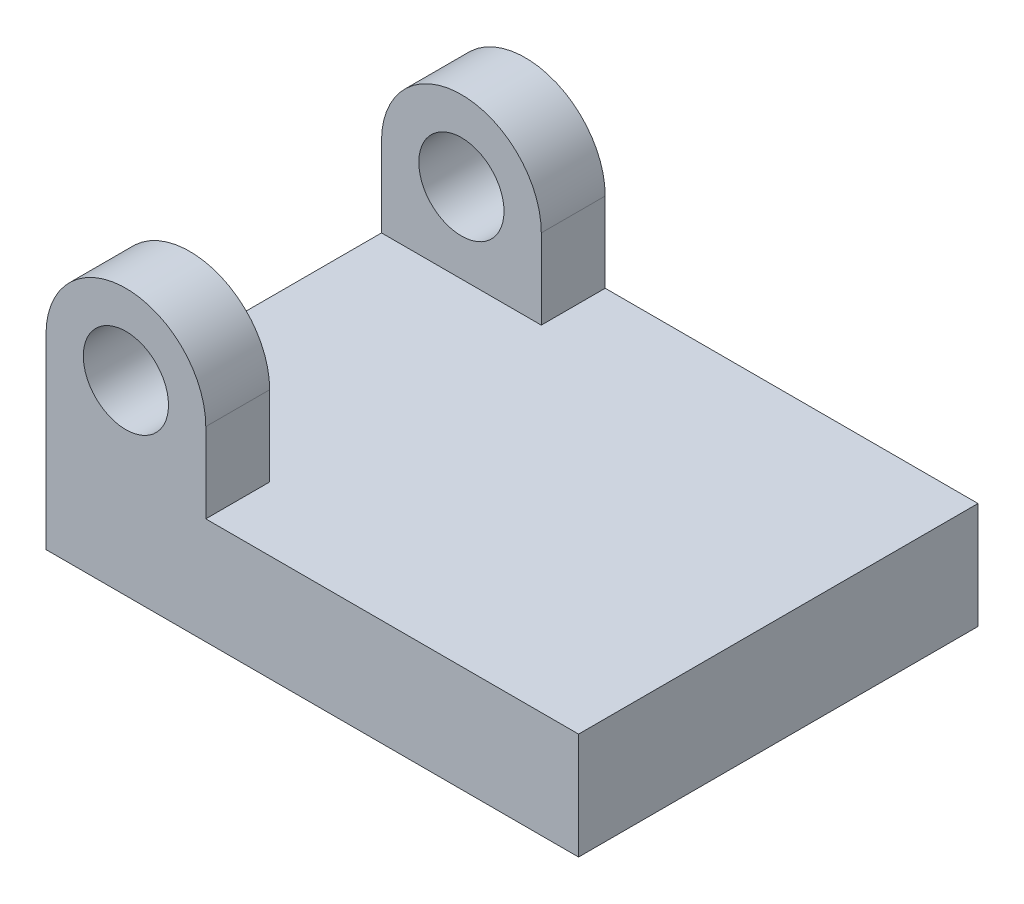
ISO-10303-21;
HEADER;
FILE_DESCRIPTION(('STEP AP214'),'2;1');
FILE_NAME('part.step','',(''),(''),'','','');
FILE_SCHEMA(('AUTOMOTIVE_DESIGN { 1 0 10303 214 1 1 1 1 }'));
ENDSEC;
DATA;
#1=APPLICATION_CONTEXT('core data for automotive mechanical design processes');
#2=APPLICATION_PROTOCOL_DEFINITION('international standard','automotive_design',2000,#1);
#3=PRODUCT_CONTEXT('',#1,'mechanical');
#4=PRODUCT('Part','Part','',(#3));
#5=PRODUCT_RELATED_PRODUCT_CATEGORY('part','',(#4));
#6=PRODUCT_DEFINITION_FORMATION('','',#4);
#7=PRODUCT_DEFINITION_CONTEXT('part definition',#1,'design');
#8=PRODUCT_DEFINITION('design','',#6,#7);
#9=PRODUCT_DEFINITION_SHAPE('','',#8);
#10=(LENGTH_UNIT() NAMED_UNIT(*) SI_UNIT(.MILLI.,.METRE.));
#11=(NAMED_UNIT(*) PLANE_ANGLE_UNIT() SI_UNIT($,.RADIAN.));
#12=(NAMED_UNIT(*) SI_UNIT($,.STERADIAN.) SOLID_ANGLE_UNIT());
#13=UNCERTAINTY_MEASURE_WITH_UNIT(LENGTH_MEASURE(1.E-05),#10,'distance_accuracy_value','');
#14=(GEOMETRIC_REPRESENTATION_CONTEXT(3) GLOBAL_UNCERTAINTY_ASSIGNED_CONTEXT((#13)) GLOBAL_UNIT_ASSIGNED_CONTEXT((#10,
#11,#12)) REPRESENTATION_CONTEXT('',''));
#15=CARTESIAN_POINT('',(0.,0.,0.));
#16=DIRECTION('',(0.,0.,1.));
#17=DIRECTION('',(1.,0.,0.));
#18=AXIS2_PLACEMENT_3D('',#15,#16,#17);
#19=CARTESIAN_POINT('',(-6.33433734939758,10.,8.51656626506026));
#20=DIRECTION('',(-1.,0.,0.));
#21=DIRECTION('',(0.,0.,1.));
#22=AXIS2_PLACEMENT_3D('',#19,#20,#21);
#23=PLANE('',#22);
#24=DIRECTION('',(0.,0.,1.));
#25=VECTOR('',#24,1.);
#26=CARTESIAN_POINT('',(-6.33433734939758,7.,-12.4834337349397));
#27=LINE('',#26,#25);
#28=CARTESIAN_POINT('',(-6.33433734939758,7.,-6.48343373493974));
#29=VERTEX_POINT('',#28);
#30=CARTESIAN_POINT('',(-6.33433734939758,7.,-4.08343373493974));
#31=VERTEX_POINT('',#30);
#32=EDGE_CURVE('E151',#29,#31,#27,.T.);
#33=ORIENTED_EDGE('',*,*,#32,.T.);
#34=DIRECTION('',(0.,1.,0.));
#35=VECTOR('',#34,1.);
#36=CARTESIAN_POINT('',(-6.33433734939759,4.,-4.08343373493974));
#37=LINE('',#36,#35);
#38=CARTESIAN_POINT('',(-6.33433734939759,4.,-4.08343373493974));
#39=VERTEX_POINT('',#38);
#40=EDGE_CURVE('E250',#39,#31,#37,.T.);
#41=ORIENTED_EDGE('',*,*,#40,.F.);
#42=DIRECTION('',(0.,0.,-1.));
#43=VECTOR('',#42,1.);
#44=CARTESIAN_POINT('',(-6.33433734939758,4.,8.51656626506026));
#45=LINE('',#44,#43);
#46=CARTESIAN_POINT('',(-6.33433734939758,4.,-6.48343373493974));
#47=VERTEX_POINT('',#46);
#48=EDGE_CURVE('E249',#39,#47,#45,.T.);
#49=ORIENTED_EDGE('',*,*,#48,.T.);
#50=DIRECTION('',(0.,-1.,0.));
#51=VECTOR('',#50,1.);
#52=CARTESIAN_POINT('',(-6.33433734939758,10.,-6.48343373493974));
#53=LINE('',#52,#51);
#54=EDGE_CURVE('E163',#29,#47,#53,.T.);
#55=ORIENTED_EDGE('',*,*,#54,.F.);
#56=EDGE_LOOP('',(#33,#41,#49,#55));
#57=FACE_BOUND('',#56,.T.);
#58=ADVANCED_FACE('F63',(#57),#23,.F.);
#59=CARTESIAN_POINT('',(-12.3343373493976,4.,8.51656626506026));
#60=DIRECTION('',(0.,0.,-1.));
#61=DIRECTION('',(-1.,0.,0.));
#62=AXIS2_PLACEMENT_3D('',#59,#60,#61);
#63=PLANE('',#62);
#64=CARTESIAN_POINT('',(-9.33433734939759,7.,8.51656626506026));
#65=DIRECTION('',(0.,0.,1.));
#66=DIRECTION('',(1.,0.,0.));
#67=AXIS2_PLACEMENT_3D('',#64,#65,#66);
#68=CIRCLE('',#67,1.6);
#69=CARTESIAN_POINT('',(-7.73433734939759,7.,8.51656626506026));
#70=VERTEX_POINT('',#69);
#71=EDGE_CURVE('E208',#70,#70,#68,.T.);
#72=ORIENTED_EDGE('',*,*,#71,.F.);
#73=EDGE_LOOP('',(#72));
#74=FACE_BOUND('',#73,.T.);
#75=DIRECTION('',(0.,-1.,0.));
#76=VECTOR('',#75,1.);
#77=CARTESIAN_POINT('',(-6.33433734939758,10.,8.51656626506026));
#78=LINE('',#77,#76);
#79=CARTESIAN_POINT('',(-6.33433734939758,7.,8.51656626506026));
#80=VERTEX_POINT('',#79);
#81=CARTESIAN_POINT('',(-6.33433734939759,4.,8.51656626506026));
#82=VERTEX_POINT('',#81);
#83=EDGE_CURVE('E87',#80,#82,#78,.T.);
#84=ORIENTED_EDGE('',*,*,#83,.F.);
#85=CARTESIAN_POINT('',(-9.33433734939759,7.,8.51656626506026));
#86=DIRECTION('',(0.,0.,1.));
#87=DIRECTION('',(1.,0.,0.));
#88=AXIS2_PLACEMENT_3D('',#85,#86,#87);
#89=CIRCLE('',#88,3.);
#90=CARTESIAN_POINT('',(-12.3343373493976,7.,8.51656626506026));
#91=VERTEX_POINT('',#90);
#92=EDGE_CURVE('E142',#91,#80,#89,.F.);
#93=ORIENTED_EDGE('',*,*,#92,.F.);
#94=DIRECTION('',(0.,-1.,0.));
#95=VECTOR('',#94,1.);
#96=CARTESIAN_POINT('',(-12.3343373493976,4.,8.51656626506026));
#97=LINE('',#96,#95);
#98=CARTESIAN_POINT('',(-12.3343373493976,0.,8.51656626506026));
#99=VERTEX_POINT('',#98);
#100=EDGE_CURVE('E72',#91,#99,#97,.T.);
#101=ORIENTED_EDGE('',*,*,#100,.T.);
#102=DIRECTION('',(1.,0.,0.));
#103=VECTOR('',#102,1.);
#104=CARTESIAN_POINT('',(-12.3343373493976,0.,8.51656626506026));
#105=LINE('',#104,#103);
#106=CARTESIAN_POINT('',(7.66566265060242,0.,8.51656626506026));
#107=VERTEX_POINT('',#106);
#108=EDGE_CURVE('E168',#99,#107,#105,.T.);
#109=ORIENTED_EDGE('',*,*,#108,.T.);
#110=DIRECTION('',(0.,-1.,0.));
#111=VECTOR('',#110,1.);
#112=CARTESIAN_POINT('',(7.66566265060242,4.,8.51656626506026));
#113=LINE('',#112,#111);
#114=CARTESIAN_POINT('',(7.66566265060242,4.,8.51656626506026));
#115=VERTEX_POINT('',#114);
#116=EDGE_CURVE('E199',#115,#107,#113,.T.);
#117=ORIENTED_EDGE('',*,*,#116,.F.);
#118=DIRECTION('',(1.,0.,0.));
#119=VECTOR('',#118,1.);
#120=CARTESIAN_POINT('',(-12.3343373493976,4.,8.51656626506026));
#121=LINE('',#120,#119);
#122=EDGE_CURVE('E160',#82,#115,#121,.T.);
#123=ORIENTED_EDGE('',*,*,#122,.F.);
#124=EDGE_LOOP('',(#84,#93,#101,#109,#117,#123));
#125=FACE_BOUND('',#124,.T.);
#126=ADVANCED_FACE('F158',(#74,#125),#63,.F.);
#127=CARTESIAN_POINT('',(-12.3343373493976,4.,-6.48343373493974));
#128=DIRECTION('',(0.,0.,1.));
#129=DIRECTION('',(1.,0.,0.));
#130=AXIS2_PLACEMENT_3D('',#127,#128,#129);
#131=PLANE('',#130);
#132=CARTESIAN_POINT('',(-9.33433734939759,7.,-6.48343373493974));
#133=DIRECTION('',(0.,0.,1.));
#134=DIRECTION('',(1.,0.,0.));
#135=AXIS2_PLACEMENT_3D('',#132,#133,#134);
#136=CIRCLE('',#135,1.6);
#137=CARTESIAN_POINT('',(-7.73433734939759,7.,-6.48343373493974));
#138=VERTEX_POINT('',#137);
#139=EDGE_CURVE('E214',#138,#138,#136,.T.);
#140=ORIENTED_EDGE('',*,*,#139,.T.);
#141=EDGE_LOOP('',(#140));
#142=FACE_BOUND('',#141,.T.);
#143=CARTESIAN_POINT('',(-9.33433734939759,7.,-6.48343373493974));
#144=DIRECTION('',(0.,0.,1.));
#145=DIRECTION('',(1.,0.,0.));
#146=AXIS2_PLACEMENT_3D('',#143,#144,#145);
#147=CIRCLE('',#146,3.);
#148=CARTESIAN_POINT('',(-12.3343373493976,7.,-6.48343373493974));
#149=VERTEX_POINT('',#148);
#150=EDGE_CURVE('E229',#149,#29,#147,.F.);
#151=ORIENTED_EDGE('',*,*,#150,.T.);
#152=ORIENTED_EDGE('',*,*,#54,.T.);
#153=DIRECTION('',(-1.,0.,0.));
#154=VECTOR('',#153,1.);
#155=CARTESIAN_POINT('',(-12.3343373493976,4.,-6.48343373493974));
#156=LINE('',#155,#154);
#157=CARTESIAN_POINT('',(7.66566265060242,4.,-6.48343373493974));
#158=VERTEX_POINT('',#157);
#159=EDGE_CURVE('E180',#158,#47,#156,.T.);
#160=ORIENTED_EDGE('',*,*,#159,.F.);
#161=DIRECTION('',(0.,-1.,0.));
#162=VECTOR('',#161,1.);
#163=CARTESIAN_POINT('',(7.66566265060242,4.,-6.48343373493974));
#164=LINE('',#163,#162);
#165=CARTESIAN_POINT('',(7.66566265060242,0.,-6.48343373493974));
#166=VERTEX_POINT('',#165);
#167=EDGE_CURVE('E195',#158,#166,#164,.T.);
#168=ORIENTED_EDGE('',*,*,#167,.T.);
#169=DIRECTION('',(-1.,0.,0.));
#170=VECTOR('',#169,1.);
#171=CARTESIAN_POINT('',(-12.3343373493976,0.,-6.48343373493974));
#172=LINE('',#171,#170);
#173=CARTESIAN_POINT('',(-12.3343373493976,0.,-6.48343373493974));
#174=VERTEX_POINT('',#173);
#175=EDGE_CURVE('E177',#166,#174,#172,.T.);
#176=ORIENTED_EDGE('',*,*,#175,.T.);
#177=DIRECTION('',(0.,-1.,0.));
#178=VECTOR('',#177,1.);
#179=CARTESIAN_POINT('',(-12.3343373493976,4.,-6.48343373493974));
#180=LINE('',#179,#178);
#181=EDGE_CURVE('E183',#149,#174,#180,.T.);
#182=ORIENTED_EDGE('',*,*,#181,.F.);
#183=EDGE_LOOP('',(#151,#152,#160,#168,#176,#182));
#184=FACE_BOUND('',#183,.T.);
#185=ADVANCED_FACE('F272',(#142,#184),#131,.F.);
#186=CARTESIAN_POINT('',(-6.33433734939758,7.,6.11656626506026));
#187=VERTEX_POINT('',#186);
#188=EDGE_CURVE('E144',#187,#80,#27,.T.);
#189=ORIENTED_EDGE('',*,*,#188,.T.);
#190=ORIENTED_EDGE('',*,*,#83,.T.);
#191=CARTESIAN_POINT('',(-6.33433734939759,4.,6.11656626506026));
#192=VERTEX_POINT('',#191);
#193=EDGE_CURVE('E170',#82,#192,#45,.T.);
#194=ORIENTED_EDGE('',*,*,#193,.T.);
#195=DIRECTION('',(0.,1.,0.));
#196=VECTOR('',#195,1.);
#197=CARTESIAN_POINT('',(-6.33433734939759,4.,6.11656626506026));
#198=LINE('',#197,#196);
#199=EDGE_CURVE('E154',#192,#187,#198,.T.);
#200=ORIENTED_EDGE('',*,*,#199,.T.);
#201=EDGE_LOOP('',(#189,#190,#194,#200));
#202=FACE_BOUND('',#201,.T.);
#203=ADVANCED_FACE('F153',(#202),#23,.F.);
#204=CARTESIAN_POINT('',(-12.3343373493976,4.,-4.08343373493974));
#205=DIRECTION('',(0.,0.,-1.));
#206=DIRECTION('',(-1.,0.,0.));
#207=AXIS2_PLACEMENT_3D('',#204,#205,#206);
#208=PLANE('',#207);
#209=CARTESIAN_POINT('',(-9.33433734939759,7.,-4.08343373493974));
#210=DIRECTION('',(0.,0.,-1.));
#211=DIRECTION('',(-1.,0.,0.));
#212=AXIS2_PLACEMENT_3D('',#209,#210,#211);
#213=CIRCLE('',#212,1.6);
#214=CARTESIAN_POINT('',(-10.9343373493976,7.,-4.08343373493974));
#215=VERTEX_POINT('',#214);
#216=EDGE_CURVE('E207',#215,#215,#213,.T.);
#217=ORIENTED_EDGE('',*,*,#216,.T.);
#218=EDGE_LOOP('',(#217));
#219=FACE_BOUND('',#218,.T.);
#220=ORIENTED_EDGE('',*,*,#40,.T.);
#221=CARTESIAN_POINT('',(-9.33433734939759,7.,-4.08343373493974));
#222=DIRECTION('',(0.,0.,-1.));
#223=DIRECTION('',(-1.,0.,0.));
#224=AXIS2_PLACEMENT_3D('',#221,#222,#223);
#225=CIRCLE('',#224,3.);
#226=CARTESIAN_POINT('',(-12.3343373493976,7.,-4.08343373493974));
#227=VERTEX_POINT('',#226);
#228=EDGE_CURVE('E226',#31,#227,#225,.F.);
#229=ORIENTED_EDGE('',*,*,#228,.T.);
#230=DIRECTION('',(0.,1.,0.));
#231=VECTOR('',#230,1.);
#232=CARTESIAN_POINT('',(-12.3343373493976,4.,-4.08343373493974));
#233=LINE('',#232,#231);
#234=CARTESIAN_POINT('',(-12.3343373493976,4.,-4.08343373493974));
#235=VERTEX_POINT('',#234);
#236=EDGE_CURVE('E245',#235,#227,#233,.T.);
#237=ORIENTED_EDGE('',*,*,#236,.F.);
#238=DIRECTION('',(-1.,0.,0.));
#239=VECTOR('',#238,1.);
#240=CARTESIAN_POINT('',(-12.3343373493976,4.,-4.08343373493974));
#241=LINE('',#240,#239);
#242=EDGE_CURVE('E240',#39,#235,#241,.T.);
#243=ORIENTED_EDGE('',*,*,#242,.F.);
#244=EDGE_LOOP('',(#220,#229,#237,#243));
#245=FACE_BOUND('',#244,.T.);
#246=ADVANCED_FACE('F280',(#219,#245),#208,.F.);
#247=CARTESIAN_POINT('',(-12.3343373493976,4.,6.11656626506026));
#248=DIRECTION('',(0.,0.,1.));
#249=DIRECTION('',(1.,0.,0.));
#250=AXIS2_PLACEMENT_3D('',#247,#248,#249);
#251=PLANE('',#250);
#252=CARTESIAN_POINT('',(-9.33433734939759,7.,6.11656626506026));
#253=DIRECTION('',(0.,0.,1.));
#254=DIRECTION('',(1.,0.,0.));
#255=AXIS2_PLACEMENT_3D('',#252,#253,#254);
#256=CIRCLE('',#255,1.6);
#257=CARTESIAN_POINT('',(-7.73433734939759,7.,6.11656626506026));
#258=VERTEX_POINT('',#257);
#259=EDGE_CURVE('E204',#258,#258,#256,.T.);
#260=ORIENTED_EDGE('',*,*,#259,.T.);
#261=EDGE_LOOP('',(#260));
#262=FACE_BOUND('',#261,.T.);
#263=CARTESIAN_POINT('',(-9.33433734939759,7.,6.11656626506026));
#264=DIRECTION('',(0.,0.,1.));
#265=DIRECTION('',(1.,0.,0.));
#266=AXIS2_PLACEMENT_3D('',#263,#264,#265);
#267=CIRCLE('',#266,3.);
#268=CARTESIAN_POINT('',(-12.3343373493976,7.,6.11656626506026));
#269=VERTEX_POINT('',#268);
#270=EDGE_CURVE('E12',#269,#187,#267,.F.);
#271=ORIENTED_EDGE('',*,*,#270,.T.);
#272=ORIENTED_EDGE('',*,*,#199,.F.);
#273=DIRECTION('',(1.,0.,0.));
#274=VECTOR('',#273,1.);
#275=CARTESIAN_POINT('',(-12.3343373493976,4.,6.11656626506026));
#276=LINE('',#275,#274);
#277=CARTESIAN_POINT('',(-12.3343373493976,4.,6.11656626506026));
#278=VERTEX_POINT('',#277);
#279=EDGE_CURVE('E236',#278,#192,#276,.T.);
#280=ORIENTED_EDGE('',*,*,#279,.F.);
#281=DIRECTION('',(0.,1.,0.));
#282=VECTOR('',#281,1.);
#283=CARTESIAN_POINT('',(-12.3343373493976,4.,6.11656626506026));
#284=LINE('',#283,#282);
#285=EDGE_CURVE('E244',#278,#269,#284,.T.);
#286=ORIENTED_EDGE('',*,*,#285,.T.);
#287=EDGE_LOOP('',(#271,#272,#280,#286));
#288=FACE_BOUND('',#287,.T.);
#289=ADVANCED_FACE('F285',(#262,#288),#251,.F.);
#290=CARTESIAN_POINT('',(-12.3343373493976,4.,-6.48343373493974));
#291=DIRECTION('',(1.,0.,0.));
#292=DIRECTION('',(0.,0.,-1.));
#293=AXIS2_PLACEMENT_3D('',#290,#291,#292);
#294=PLANE('',#293);
#295=ORIENTED_EDGE('',*,*,#100,.F.);
#296=DIRECTION('',(0.,0.,1.));
#297=VECTOR('',#296,1.);
#298=CARTESIAN_POINT('',(-12.3343373493976,7.,-12.4834337349397));
#299=LINE('',#298,#297);
#300=EDGE_CURVE('E147',#269,#91,#299,.T.);
#301=ORIENTED_EDGE('',*,*,#300,.F.);
#302=ORIENTED_EDGE('',*,*,#285,.F.);
#303=DIRECTION('',(0.,0.,1.));
#304=VECTOR('',#303,1.);
#305=CARTESIAN_POINT('',(-12.3343373493976,4.,-4.08343373493974));
#306=LINE('',#305,#304);
#307=EDGE_CURVE('E232',#235,#278,#306,.T.);
#308=ORIENTED_EDGE('',*,*,#307,.F.);
#309=ORIENTED_EDGE('',*,*,#236,.T.);
#310=EDGE_CURVE('E79',#149,#227,#299,.T.);
#311=ORIENTED_EDGE('',*,*,#310,.F.);
#312=ORIENTED_EDGE('',*,*,#181,.T.);
#313=DIRECTION('',(0.,0.,1.));
#314=VECTOR('',#313,1.);
#315=CARTESIAN_POINT('',(-12.3343373493976,0.,-6.48343373493974));
#316=LINE('',#315,#314);
#317=EDGE_CURVE('E162',#174,#99,#316,.T.);
#318=ORIENTED_EDGE('',*,*,#317,.T.);
#319=EDGE_LOOP('',(#295,#301,#302,#308,#309,#311,#312,#318));
#320=FACE_BOUND('',#319,.T.);
#321=ADVANCED_FACE('F65',(#320),#294,.F.);
#322=CARTESIAN_POINT('',(7.66566265060242,4.,-6.48343373493974));
#323=DIRECTION('',(-1.,0.,0.));
#324=DIRECTION('',(0.,0.,1.));
#325=AXIS2_PLACEMENT_3D('',#322,#323,#324);
#326=PLANE('',#325);
#327=DIRECTION('',(0.,0.,-1.));
#328=VECTOR('',#327,1.);
#329=CARTESIAN_POINT('',(7.66566265060242,0.,-6.48343373493974));
#330=LINE('',#329,#328);
#331=EDGE_CURVE('E187',#107,#166,#330,.T.);
#332=ORIENTED_EDGE('',*,*,#331,.T.);
#333=ORIENTED_EDGE('',*,*,#167,.F.);
#334=DIRECTION('',(0.,0.,-1.));
#335=VECTOR('',#334,1.);
#336=CARTESIAN_POINT('',(7.66566265060242,4.,-6.48343373493974));
#337=LINE('',#336,#335);
#338=EDGE_CURVE('E176',#115,#158,#337,.T.);
#339=ORIENTED_EDGE('',*,*,#338,.F.);
#340=ORIENTED_EDGE('',*,*,#116,.T.);
#341=EDGE_LOOP('',(#332,#333,#339,#340));
#342=FACE_BOUND('',#341,.T.);
#343=ADVANCED_FACE('F289',(#342),#326,.F.);
#344=CARTESIAN_POINT('',(0.,4.,0.));
#345=DIRECTION('',(0.,1.,0.));
#346=DIRECTION('',(0.,0.,1.));
#347=AXIS2_PLACEMENT_3D('',#344,#345,#346);
#348=PLANE('',#347);
#349=ORIENTED_EDGE('',*,*,#193,.F.);
#350=ORIENTED_EDGE('',*,*,#122,.T.);
#351=ORIENTED_EDGE('',*,*,#338,.T.);
#352=ORIENTED_EDGE('',*,*,#159,.T.);
#353=ORIENTED_EDGE('',*,*,#48,.F.);
#354=ORIENTED_EDGE('',*,*,#242,.T.);
#355=ORIENTED_EDGE('',*,*,#307,.T.);
#356=ORIENTED_EDGE('',*,*,#279,.T.);
#357=EDGE_LOOP('',(#349,#350,#351,#352,#353,#354,#355,#356));
#358=FACE_BOUND('',#357,.T.);
#359=ADVANCED_FACE('F268',(#358),#348,.T.);
#360=CARTESIAN_POINT('',(0.,0.,0.));
#361=DIRECTION('',(0.,1.,0.));
#362=DIRECTION('',(0.,0.,1.));
#363=AXIS2_PLACEMENT_3D('',#360,#361,#362);
#364=PLANE('',#363);
#365=ORIENTED_EDGE('',*,*,#317,.F.);
#366=ORIENTED_EDGE('',*,*,#175,.F.);
#367=ORIENTED_EDGE('',*,*,#331,.F.);
#368=ORIENTED_EDGE('',*,*,#108,.F.);
#369=EDGE_LOOP('',(#365,#366,#367,#368));
#370=FACE_BOUND('',#369,.T.);
#371=ADVANCED_FACE('F292',(#370),#364,.F.);
#372=CARTESIAN_POINT('',(-9.33433734939759,7.,-12.4834337349397));
#373=DIRECTION('',(0.,0.,1.));
#374=DIRECTION('',(1.,0.,0.));
#375=AXIS2_PLACEMENT_3D('',#372,#373,#374);
#376=CYLINDRICAL_SURFACE('',#375,1.6);
#377=ORIENTED_EDGE('',*,*,#71,.T.);
#378=EDGE_LOOP('',(#377));
#379=FACE_BOUND('',#378,.T.);
#380=ORIENTED_EDGE('',*,*,#259,.F.);
#381=EDGE_LOOP('',(#380));
#382=FACE_BOUND('',#381,.T.);
#383=ADVANCED_FACE('F294',(#379,#382),#376,.F.);
#384=CARTESIAN_POINT('',(-9.33433734939759,7.,-12.4834337349397));
#385=DIRECTION('',(0.,0.,1.));
#386=DIRECTION('',(1.,0.,0.));
#387=AXIS2_PLACEMENT_3D('',#384,#385,#386);
#388=CYLINDRICAL_SURFACE('',#387,3.);
#389=ORIENTED_EDGE('',*,*,#300,.T.);
#390=ORIENTED_EDGE('',*,*,#92,.T.);
#391=ORIENTED_EDGE('',*,*,#188,.F.);
#392=ORIENTED_EDGE('',*,*,#270,.F.);
#393=EDGE_LOOP('',(#389,#390,#391,#392));
#394=FACE_BOUND('',#393,.T.);
#395=ADVANCED_FACE('F143',(#394),#388,.T.);
#396=ORIENTED_EDGE('',*,*,#216,.F.);
#397=EDGE_LOOP('',(#396));
#398=FACE_BOUND('',#397,.T.);
#399=ORIENTED_EDGE('',*,*,#139,.F.);
#400=EDGE_LOOP('',(#399));
#401=FACE_BOUND('',#400,.T.);
#402=ADVANCED_FACE('F301',(#398,#401),#376,.F.);
#403=ORIENTED_EDGE('',*,*,#310,.T.);
#404=ORIENTED_EDGE('',*,*,#228,.F.);
#405=ORIENTED_EDGE('',*,*,#32,.F.);
#406=ORIENTED_EDGE('',*,*,#150,.F.);
#407=EDGE_LOOP('',(#403,#404,#405,#406));
#408=FACE_BOUND('',#407,.T.);
#409=ADVANCED_FACE('F276',(#408),#388,.T.);
#410=CLOSED_SHELL('',(#58,#126,#185,#203,#246,#289,#321,#343,#359,#371,#383,#395,#402,#409));
#411=MANIFOLD_SOLID_BREP('B2',#410);
#412=ADVANCED_BREP_SHAPE_REPRESENTATION('',(#18,#411),#14);
#413=SHAPE_DEFINITION_REPRESENTATION(#9,#412);
ENDSEC;
END-ISO-10303-21;
